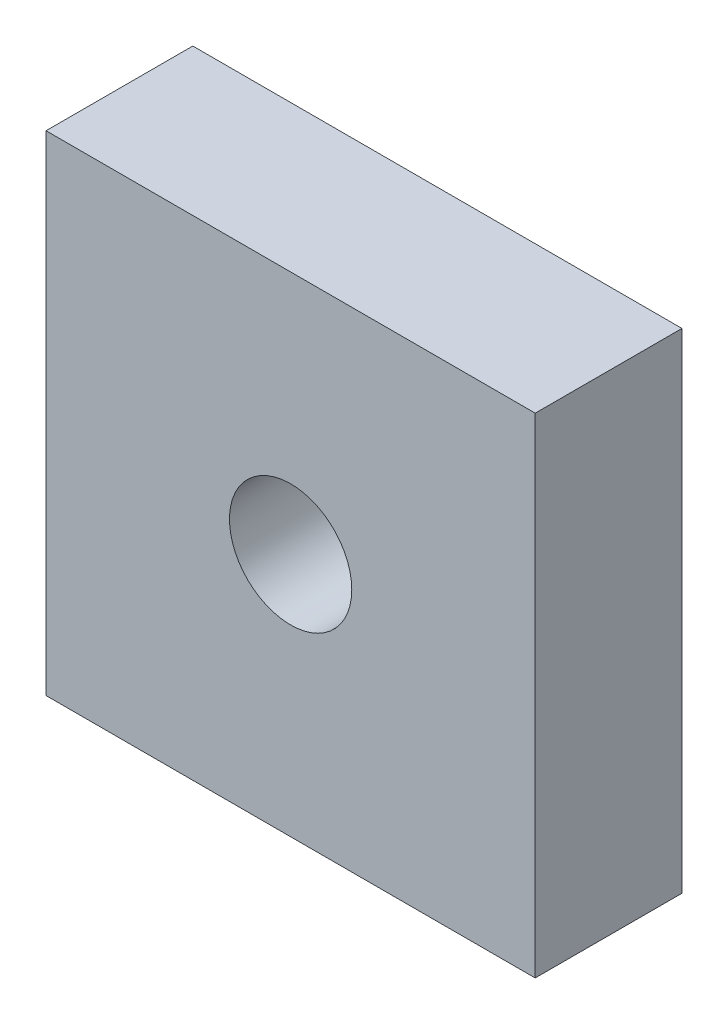
ISO-10303-21;
HEADER;
FILE_DESCRIPTION(('STEP AP214'),'2;1');
FILE_NAME('part.step','',(''),(''),'','','');
FILE_SCHEMA(('AUTOMOTIVE_DESIGN { 1 0 10303 214 1 1 1 1 }'));
ENDSEC;
DATA;
#1=APPLICATION_CONTEXT('core data for automotive mechanical design processes');
#2=APPLICATION_PROTOCOL_DEFINITION('international standard','automotive_design',2000,#1);
#3=PRODUCT_CONTEXT('',#1,'mechanical');
#4=PRODUCT('Part','Part','',(#3));
#5=PRODUCT_RELATED_PRODUCT_CATEGORY('part','',(#4));
#6=PRODUCT_DEFINITION_FORMATION('','',#4);
#7=PRODUCT_DEFINITION_CONTEXT('part definition',#1,'design');
#8=PRODUCT_DEFINITION('design','',#6,#7);
#9=PRODUCT_DEFINITION_SHAPE('','',#8);
#10=(LENGTH_UNIT() NAMED_UNIT(*) SI_UNIT(.MILLI.,.METRE.));
#11=(NAMED_UNIT(*) PLANE_ANGLE_UNIT() SI_UNIT($,.RADIAN.));
#12=(NAMED_UNIT(*) SI_UNIT($,.STERADIAN.) SOLID_ANGLE_UNIT());
#13=UNCERTAINTY_MEASURE_WITH_UNIT(LENGTH_MEASURE(1.E-05),#10,'distance_accuracy_value','');
#14=(GEOMETRIC_REPRESENTATION_CONTEXT(3) GLOBAL_UNCERTAINTY_ASSIGNED_CONTEXT((#13)) GLOBAL_UNIT_ASSIGNED_CONTEXT((#10,
#11,#12)) REPRESENTATION_CONTEXT('',''));
#15=CARTESIAN_POINT('',(0.,0.,0.));
#16=DIRECTION('',(0.,0.,1.));
#17=DIRECTION('',(1.,0.,0.));
#18=AXIS2_PLACEMENT_3D('',#15,#16,#17);
#19=CARTESIAN_POINT('',(0.,0.,6.));
#20=DIRECTION('',(0.,0.,1.));
#21=DIRECTION('',(1.,0.,0.));
#22=AXIS2_PLACEMENT_3D('',#19,#20,#21);
#23=PLANE('',#22);
#24=DIRECTION('',(0.,1.,0.));
#25=VECTOR('',#24,1.);
#26=CARTESIAN_POINT('',(10.,10.,6.));
#27=LINE('',#26,#25);
#28=CARTESIAN_POINT('',(10.,-10.,6.));
#29=VERTEX_POINT('',#28);
#30=CARTESIAN_POINT('',(10.,10.,6.));
#31=VERTEX_POINT('',#30);
#32=EDGE_CURVE('E85',#29,#31,#27,.T.);
#33=ORIENTED_EDGE('',*,*,#32,.T.);
#34=DIRECTION('',(-1.,0.,0.));
#35=VECTOR('',#34,1.);
#36=CARTESIAN_POINT('',(-10.,10.,6.));
#37=LINE('',#36,#35);
#38=CARTESIAN_POINT('',(-10.,10.,6.));
#39=VERTEX_POINT('',#38);
#40=EDGE_CURVE('E80',#31,#39,#37,.T.);
#41=ORIENTED_EDGE('',*,*,#40,.T.);
#42=DIRECTION('',(0.,-1.,0.));
#43=VECTOR('',#42,1.);
#44=CARTESIAN_POINT('',(-10.,10.,6.));
#45=LINE('',#44,#43);
#46=CARTESIAN_POINT('',(-10.,-10.,6.));
#47=VERTEX_POINT('',#46);
#48=EDGE_CURVE('E83',#39,#47,#45,.T.);
#49=ORIENTED_EDGE('',*,*,#48,.T.);
#50=DIRECTION('',(1.,0.,0.));
#51=VECTOR('',#50,1.);
#52=CARTESIAN_POINT('',(-10.,-10.,6.));
#53=LINE('',#52,#51);
#54=EDGE_CURVE('E50',#47,#29,#53,.T.);
#55=ORIENTED_EDGE('',*,*,#54,.T.);
#56=EDGE_LOOP('',(#33,#41,#49,#55));
#57=FACE_BOUND('',#56,.T.);
#58=CARTESIAN_POINT('',(0.,0.,6.));
#59=DIRECTION('',(0.,0.,1.));
#60=DIRECTION('',(1.,0.,0.));
#61=AXIS2_PLACEMENT_3D('',#58,#59,#60);
#62=CIRCLE('',#61,2.5);
#63=CARTESIAN_POINT('',(2.5,0.,6.));
#64=VERTEX_POINT('',#63);
#65=EDGE_CURVE('E100',#64,#64,#62,.T.);
#66=ORIENTED_EDGE('',*,*,#65,.F.);
#67=EDGE_LOOP('',(#66));
#68=FACE_BOUND('',#67,.T.);
#69=ADVANCED_FACE('F33',(#57,#68),#23,.T.);
#70=CARTESIAN_POINT('',(0.,0.,0.));
#71=DIRECTION('',(0.,0.,1.));
#72=DIRECTION('',(1.,0.,0.));
#73=AXIS2_PLACEMENT_3D('',#70,#71,#72);
#74=PLANE('',#73);
#75=DIRECTION('',(0.,1.,0.));
#76=VECTOR('',#75,1.);
#77=CARTESIAN_POINT('',(10.,10.,0.));
#78=LINE('',#77,#76);
#79=CARTESIAN_POINT('',(10.,-10.,0.));
#80=VERTEX_POINT('',#79);
#81=CARTESIAN_POINT('',(10.,10.,0.));
#82=VERTEX_POINT('',#81);
#83=EDGE_CURVE('E97',#80,#82,#78,.T.);
#84=ORIENTED_EDGE('',*,*,#83,.F.);
#85=DIRECTION('',(1.,0.,0.));
#86=VECTOR('',#85,1.);
#87=CARTESIAN_POINT('',(-10.,-10.,0.));
#88=LINE('',#87,#86);
#89=CARTESIAN_POINT('',(-10.,-10.,0.));
#90=VERTEX_POINT('',#89);
#91=EDGE_CURVE('E73',#90,#80,#88,.T.);
#92=ORIENTED_EDGE('',*,*,#91,.F.);
#93=DIRECTION('',(0.,-1.,0.));
#94=VECTOR('',#93,1.);
#95=CARTESIAN_POINT('',(-10.,10.,0.));
#96=LINE('',#95,#94);
#97=CARTESIAN_POINT('',(-10.,10.,0.));
#98=VERTEX_POINT('',#97);
#99=EDGE_CURVE('E67',#98,#90,#96,.T.);
#100=ORIENTED_EDGE('',*,*,#99,.F.);
#101=DIRECTION('',(-1.,0.,0.));
#102=VECTOR('',#101,1.);
#103=CARTESIAN_POINT('',(-10.,10.,0.));
#104=LINE('',#103,#102);
#105=EDGE_CURVE('E89',#82,#98,#104,.T.);
#106=ORIENTED_EDGE('',*,*,#105,.F.);
#107=EDGE_LOOP('',(#84,#92,#100,#106));
#108=FACE_BOUND('',#107,.T.);
#109=CARTESIAN_POINT('',(0.,0.,0.));
#110=DIRECTION('',(0.,0.,1.));
#111=DIRECTION('',(1.,0.,0.));
#112=AXIS2_PLACEMENT_3D('',#109,#110,#111);
#113=CIRCLE('',#112,2.5);
#114=CARTESIAN_POINT('',(2.5,0.,0.));
#115=VERTEX_POINT('',#114);
#116=EDGE_CURVE('E112',#115,#115,#113,.T.);
#117=ORIENTED_EDGE('',*,*,#116,.T.);
#118=EDGE_LOOP('',(#117));
#119=FACE_BOUND('',#118,.T.);
#120=ADVANCED_FACE('F108',(#108,#119),#74,.F.);
#121=CARTESIAN_POINT('',(10.,10.,6.));
#122=DIRECTION('',(-1.,0.,0.));
#123=DIRECTION('',(0.,-1.,0.));
#124=AXIS2_PLACEMENT_3D('',#121,#122,#123);
#125=PLANE('',#124);
#126=ORIENTED_EDGE('',*,*,#83,.T.);
#127=DIRECTION('',(0.,0.,-1.));
#128=VECTOR('',#127,1.);
#129=CARTESIAN_POINT('',(10.,10.,6.));
#130=LINE('',#129,#128);
#131=EDGE_CURVE('E11',#31,#82,#130,.T.);
#132=ORIENTED_EDGE('',*,*,#131,.F.);
#133=ORIENTED_EDGE('',*,*,#32,.F.);
#134=DIRECTION('',(0.,0.,-1.));
#135=VECTOR('',#134,1.);
#136=CARTESIAN_POINT('',(10.,-10.,6.));
#137=LINE('',#136,#135);
#138=EDGE_CURVE('E93',#29,#80,#137,.T.);
#139=ORIENTED_EDGE('',*,*,#138,.T.);
#140=EDGE_LOOP('',(#126,#132,#133,#139));
#141=FACE_BOUND('',#140,.T.);
#142=ADVANCED_FACE('F35',(#141),#125,.F.);
#143=CARTESIAN_POINT('',(-10.,10.,6.));
#144=DIRECTION('',(0.,-1.,0.));
#145=DIRECTION('',(0.,0.,-1.));
#146=AXIS2_PLACEMENT_3D('',#143,#144,#145);
#147=PLANE('',#146);
#148=ORIENTED_EDGE('',*,*,#105,.T.);
#149=DIRECTION('',(0.,0.,-1.));
#150=VECTOR('',#149,1.);
#151=CARTESIAN_POINT('',(-10.,10.,6.));
#152=LINE('',#151,#150);
#153=EDGE_CURVE('E42',#39,#98,#152,.T.);
#154=ORIENTED_EDGE('',*,*,#153,.F.);
#155=ORIENTED_EDGE('',*,*,#40,.F.);
#156=ORIENTED_EDGE('',*,*,#131,.T.);
#157=EDGE_LOOP('',(#148,#154,#155,#156));
#158=FACE_BOUND('',#157,.T.);
#159=ADVANCED_FACE('F88',(#158),#147,.F.);
#160=CARTESIAN_POINT('',(-10.,10.,6.));
#161=DIRECTION('',(1.,0.,0.));
#162=DIRECTION('',(0.,1.,0.));
#163=AXIS2_PLACEMENT_3D('',#160,#161,#162);
#164=PLANE('',#163);
#165=ORIENTED_EDGE('',*,*,#99,.T.);
#166=DIRECTION('',(0.,0.,-1.));
#167=VECTOR('',#166,1.);
#168=CARTESIAN_POINT('',(-10.,-10.,6.));
#169=LINE('',#168,#167);
#170=EDGE_CURVE('E90',#47,#90,#169,.T.);
#171=ORIENTED_EDGE('',*,*,#170,.F.);
#172=ORIENTED_EDGE('',*,*,#48,.F.);
#173=ORIENTED_EDGE('',*,*,#153,.T.);
#174=EDGE_LOOP('',(#165,#171,#172,#173));
#175=FACE_BOUND('',#174,.T.);
#176=ADVANCED_FACE('F91',(#175),#164,.F.);
#177=CARTESIAN_POINT('',(-10.,-10.,6.));
#178=DIRECTION('',(0.,1.,0.));
#179=DIRECTION('',(0.,0.,1.));
#180=AXIS2_PLACEMENT_3D('',#177,#178,#179);
#181=PLANE('',#180);
#182=ORIENTED_EDGE('',*,*,#91,.T.);
#183=ORIENTED_EDGE('',*,*,#138,.F.);
#184=ORIENTED_EDGE('',*,*,#54,.F.);
#185=ORIENTED_EDGE('',*,*,#170,.T.);
#186=EDGE_LOOP('',(#182,#183,#184,#185));
#187=FACE_BOUND('',#186,.T.);
#188=ADVANCED_FACE('F105',(#187),#181,.F.);
#189=CARTESIAN_POINT('',(0.,0.,6.));
#190=DIRECTION('',(0.,0.,-1.));
#191=DIRECTION('',(-1.,0.,0.));
#192=AXIS2_PLACEMENT_3D('',#189,#190,#191);
#193=CYLINDRICAL_SURFACE('',#192,2.5);
#194=ORIENTED_EDGE('',*,*,#65,.T.);
#195=EDGE_LOOP('',(#194));
#196=FACE_BOUND('',#195,.T.);
#197=ORIENTED_EDGE('',*,*,#116,.F.);
#198=EDGE_LOOP('',(#197));
#199=FACE_BOUND('',#198,.T.);
#200=ADVANCED_FACE('F118',(#196,#199),#193,.F.);
#201=CLOSED_SHELL('',(#69,#120,#142,#159,#176,#188,#200));
#202=MANIFOLD_SOLID_BREP('B2',#201);
#203=ADVANCED_BREP_SHAPE_REPRESENTATION('',(#18,#202),#14);
#204=SHAPE_DEFINITION_REPRESENTATION(#9,#203);
ENDSEC;
END-ISO-10303-21;
